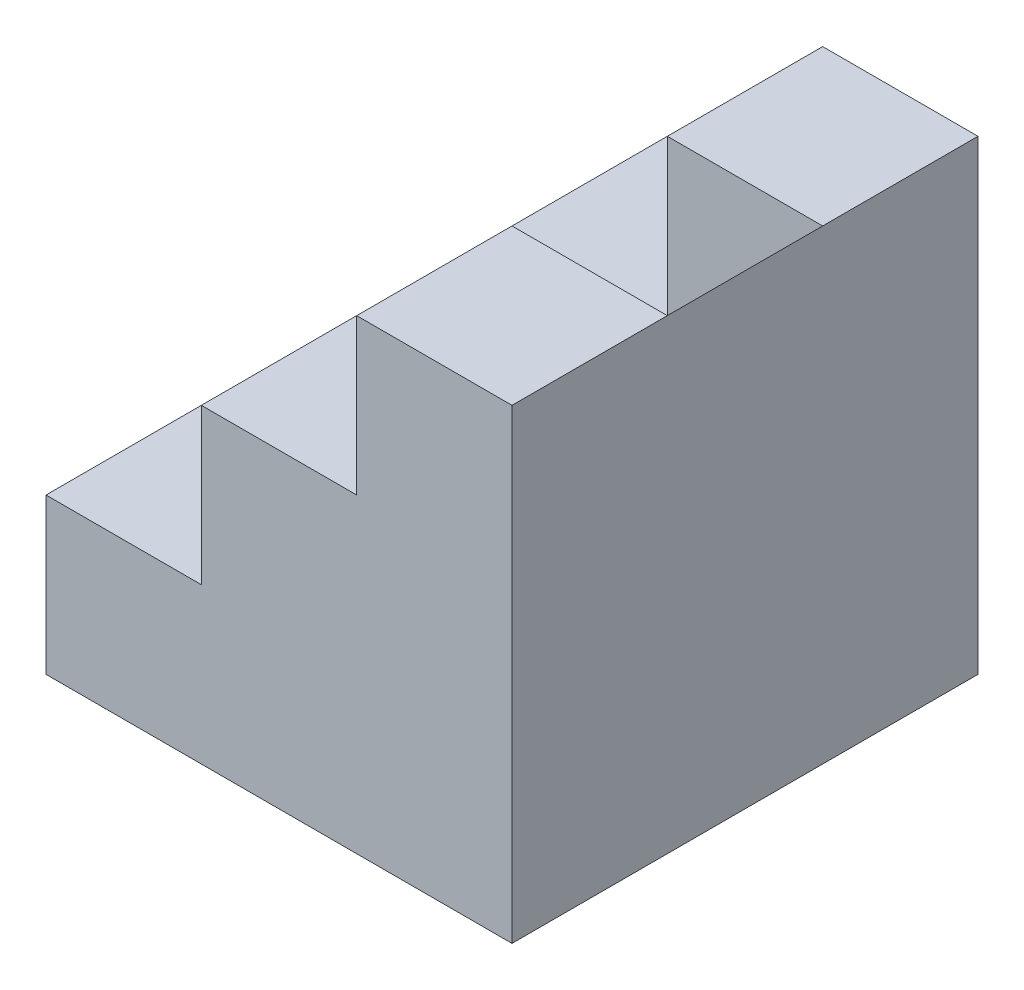
ISO-10303-21;
HEADER;
FILE_DESCRIPTION(('STEP AP214'),'2;1');
FILE_NAME('part.step','',(''),(''),'','','');
FILE_SCHEMA(('AUTOMOTIVE_DESIGN { 1 0 10303 214 1 1 1 1 }'));
ENDSEC;
DATA;
#1=APPLICATION_CONTEXT('core data for automotive mechanical design processes');
#2=APPLICATION_PROTOCOL_DEFINITION('international standard','automotive_design',2000,#1);
#3=PRODUCT_CONTEXT('',#1,'mechanical');
#4=PRODUCT('Part','Part','',(#3));
#5=PRODUCT_RELATED_PRODUCT_CATEGORY('part','',(#4));
#6=PRODUCT_DEFINITION_FORMATION('','',#4);
#7=PRODUCT_DEFINITION_CONTEXT('part definition',#1,'design');
#8=PRODUCT_DEFINITION('design','',#6,#7);
#9=PRODUCT_DEFINITION_SHAPE('','',#8);
#10=(LENGTH_UNIT() NAMED_UNIT(*) SI_UNIT(.MILLI.,.METRE.));
#11=(NAMED_UNIT(*) PLANE_ANGLE_UNIT() SI_UNIT($,.RADIAN.));
#12=(NAMED_UNIT(*) SI_UNIT($,.STERADIAN.) SOLID_ANGLE_UNIT());
#13=UNCERTAINTY_MEASURE_WITH_UNIT(LENGTH_MEASURE(1.E-05),#10,'distance_accuracy_value','');
#14=(GEOMETRIC_REPRESENTATION_CONTEXT(3) GLOBAL_UNCERTAINTY_ASSIGNED_CONTEXT((#13)) GLOBAL_UNIT_ASSIGNED_CONTEXT((#10,
#11,#12)) REPRESENTATION_CONTEXT('',''));
#15=CARTESIAN_POINT('',(0.,0.,0.));
#16=DIRECTION('',(0.,0.,1.));
#17=DIRECTION('',(1.,0.,0.));
#18=AXIS2_PLACEMENT_3D('',#15,#16,#17);
#19=CARTESIAN_POINT('',(-60.,0.,-20.));
#20=DIRECTION('',(0.,0.,1.));
#21=DIRECTION('',(1.,0.,0.));
#22=AXIS2_PLACEMENT_3D('',#19,#20,#21);
#23=PLANE('',#22);
#24=DIRECTION('',(1.,0.,0.));
#25=VECTOR('',#24,1.);
#26=CARTESIAN_POINT('',(-60.,60.,-20.));
#27=LINE('',#26,#25);
#28=CARTESIAN_POINT('',(-20.,60.,-20.));
#29=VERTEX_POINT('',#28);
#30=CARTESIAN_POINT('',(0.,60.,-20.));
#31=VERTEX_POINT('',#30);
#32=EDGE_CURVE('E197',#29,#31,#27,.T.);
#33=ORIENTED_EDGE('',*,*,#32,.T.);
#34=DIRECTION('',(-0.707106781186541,-0.707106781186554,0.));
#35=VECTOR('',#34,1.);
#36=CARTESIAN_POINT('',(0.,60.,-20.));
#37=LINE('',#36,#35);
#38=CARTESIAN_POINT('',(-20.,39.9999999999996,-20.));
#39=VERTEX_POINT('',#38);
#40=EDGE_CURVE('E48',#31,#39,#37,.T.);
#41=ORIENTED_EDGE('',*,*,#40,.T.);
#42=DIRECTION('',(0.,1.,0.));
#43=VECTOR('',#42,1.);
#44=CARTESIAN_POINT('',(-20.,0.,-20.));
#45=LINE('',#44,#43);
#46=EDGE_CURVE('E55',#39,#29,#45,.T.);
#47=ORIENTED_EDGE('',*,*,#46,.T.);
#48=EDGE_LOOP('',(#33,#41,#47));
#49=FACE_BOUND('',#48,.T.);
#50=ADVANCED_FACE('F36',(#49),#23,.F.);
#51=DIRECTION('',(1.,0.,0.));
#52=VECTOR('',#51,1.);
#53=CARTESIAN_POINT('',(0.,40.,-20.));
#54=LINE('',#53,#52);
#55=CARTESIAN_POINT('',(-40.,40.,-20.));
#56=VERTEX_POINT('',#55);
#57=EDGE_CURVE('E218',#56,#39,#54,.T.);
#58=ORIENTED_EDGE('',*,*,#57,.T.);
#59=CARTESIAN_POINT('',(-40.,19.9999999999993,-20.));
#60=VERTEX_POINT('',#59);
#61=EDGE_CURVE('E11',#39,#60,#37,.T.);
#62=ORIENTED_EDGE('',*,*,#61,.T.);
#63=DIRECTION('',(0.,1.,0.));
#64=VECTOR('',#63,1.);
#65=CARTESIAN_POINT('',(-40.,0.,-20.));
#66=LINE('',#65,#64);
#67=EDGE_CURVE('E221',#60,#56,#66,.T.);
#68=ORIENTED_EDGE('',*,*,#67,.T.);
#69=EDGE_LOOP('',(#58,#62,#68));
#70=FACE_BOUND('',#69,.T.);
#71=ADVANCED_FACE('F274',(#70),#23,.F.);
#72=CARTESIAN_POINT('',(0.,60.,-60.));
#73=DIRECTION('',(1.,0.,0.));
#74=DIRECTION('',(0.,1.,0.));
#75=AXIS2_PLACEMENT_3D('',#72,#73,#74);
#76=PLANE('',#75);
#77=DIRECTION('',(0.,0.,1.));
#78=VECTOR('',#77,1.);
#79=CARTESIAN_POINT('',(0.,0.,-60.));
#80=LINE('',#79,#78);
#81=CARTESIAN_POINT('',(0.,0.,-60.));
#82=VERTEX_POINT('',#81);
#83=CARTESIAN_POINT('',(0.,0.,0.));
#84=VERTEX_POINT('',#83);
#85=EDGE_CURVE('E229',#82,#84,#80,.T.);
#86=ORIENTED_EDGE('',*,*,#85,.F.);
#87=DIRECTION('',(0.,1.,0.));
#88=VECTOR('',#87,1.);
#89=CARTESIAN_POINT('',(0.,60.,-60.));
#90=LINE('',#89,#88);
#91=CARTESIAN_POINT('',(0.,60.,-60.));
#92=VERTEX_POINT('',#91);
#93=EDGE_CURVE('E171',#82,#92,#90,.T.);
#94=ORIENTED_EDGE('',*,*,#93,.T.);
#95=DIRECTION('',(0.,0.,1.));
#96=VECTOR('',#95,1.);
#97=CARTESIAN_POINT('',(0.,60.,-60.));
#98=LINE('',#97,#96);
#99=CARTESIAN_POINT('',(0.,60.,-40.));
#100=VERTEX_POINT('',#99);
#101=EDGE_CURVE('E161',#92,#100,#98,.T.);
#102=ORIENTED_EDGE('',*,*,#101,.T.);
#103=DIRECTION('',(0.,0.,-1.));
#104=VECTOR('',#103,1.);
#105=CARTESIAN_POINT('',(0.,60.,0.002000000000002));
#106=LINE('',#105,#104);
#107=EDGE_CURVE('E169',#31,#100,#106,.T.);
#108=ORIENTED_EDGE('',*,*,#107,.F.);
#109=DIRECTION('',(0.,0.,1.));
#110=VECTOR('',#109,1.);
#111=CARTESIAN_POINT('',(0.,60.,-60.));
#112=LINE('',#111,#110);
#113=CARTESIAN_POINT('',(0.,60.,0.));
#114=VERTEX_POINT('',#113);
#115=EDGE_CURVE('E40',#31,#114,#112,.T.);
#116=ORIENTED_EDGE('',*,*,#115,.T.);
#117=DIRECTION('',(0.,1.,0.));
#118=VECTOR('',#117,1.);
#119=CARTESIAN_POINT('',(0.,60.,0.));
#120=LINE('',#119,#118);
#121=EDGE_CURVE('E184',#84,#114,#120,.T.);
#122=ORIENTED_EDGE('',*,*,#121,.F.);
#123=EDGE_LOOP('',(#86,#94,#102,#108,#116,#122));
#124=FACE_BOUND('',#123,.T.);
#125=ADVANCED_FACE('F38',(#124),#76,.T.);
#126=CARTESIAN_POINT('',(0.,0.,-60.));
#127=DIRECTION('',(0.,-1.,0.));
#128=DIRECTION('',(1.,0.,0.));
#129=AXIS2_PLACEMENT_3D('',#126,#127,#128);
#130=PLANE('',#129);
#131=DIRECTION('',(0.,0.,1.));
#132=VECTOR('',#131,1.);
#133=CARTESIAN_POINT('',(-60.,0.,-60.));
#134=LINE('',#133,#132);
#135=CARTESIAN_POINT('',(-60.,0.,-20.));
#136=VERTEX_POINT('',#135);
#137=CARTESIAN_POINT('',(-60.,0.,0.));
#138=VERTEX_POINT('',#137);
#139=EDGE_CURVE('E209',#136,#138,#134,.T.);
#140=ORIENTED_EDGE('',*,*,#139,.F.);
#141=DIRECTION('',(0.,0.,-1.));
#142=VECTOR('',#141,1.);
#143=CARTESIAN_POINT('',(-59.9999999999989,0.,0.002000000000002));
#144=LINE('',#143,#142);
#145=CARTESIAN_POINT('',(-59.9999999999989,0.,-40.));
#146=VERTEX_POINT('',#145);
#147=EDGE_CURVE('E176',#136,#146,#144,.T.);
#148=ORIENTED_EDGE('',*,*,#147,.T.);
#149=DIRECTION('',(0.,0.,1.));
#150=VECTOR('',#149,1.);
#151=CARTESIAN_POINT('',(-60.,0.,-60.));
#152=LINE('',#151,#150);
#153=CARTESIAN_POINT('',(-60.,0.,-60.));
#154=VERTEX_POINT('',#153);
#155=EDGE_CURVE('E172',#154,#146,#152,.T.);
#156=ORIENTED_EDGE('',*,*,#155,.F.);
#157=DIRECTION('',(1.,0.,0.));
#158=VECTOR('',#157,1.);
#159=CARTESIAN_POINT('',(0.,0.,-60.));
#160=LINE('',#159,#158);
#161=EDGE_CURVE('E173',#154,#82,#160,.T.);
#162=ORIENTED_EDGE('',*,*,#161,.T.);
#163=ORIENTED_EDGE('',*,*,#85,.T.);
#164=DIRECTION('',(1.,0.,0.));
#165=VECTOR('',#164,1.);
#166=CARTESIAN_POINT('',(0.,0.,0.));
#167=LINE('',#166,#165);
#168=EDGE_CURVE('E181',#138,#84,#167,.T.);
#169=ORIENTED_EDGE('',*,*,#168,.F.);
#170=EDGE_LOOP('',(#140,#148,#156,#162,#163,#169));
#171=FACE_BOUND('',#170,.T.);
#172=ADVANCED_FACE('F242',(#171),#130,.T.);
#173=CARTESIAN_POINT('',(-60.,0.,-60.));
#174=DIRECTION('',(-1.,0.,0.));
#175=DIRECTION('',(0.,0.,1.));
#176=AXIS2_PLACEMENT_3D('',#173,#174,#175);
#177=PLANE('',#176);
#178=DIRECTION('',(0.,1.,0.));
#179=VECTOR('',#178,1.);
#180=CARTESIAN_POINT('',(-60.,0.,-20.));
#181=LINE('',#180,#179);
#182=CARTESIAN_POINT('',(-60.,20.,-20.));
#183=VERTEX_POINT('',#182);
#184=EDGE_CURVE('E226',#136,#183,#181,.T.);
#185=ORIENTED_EDGE('',*,*,#184,.F.);
#186=ORIENTED_EDGE('',*,*,#139,.T.);
#187=DIRECTION('',(0.,-1.,0.));
#188=VECTOR('',#187,1.);
#189=CARTESIAN_POINT('',(-60.,0.,0.));
#190=LINE('',#189,#188);
#191=CARTESIAN_POINT('',(-60.,20.,0.));
#192=VERTEX_POINT('',#191);
#193=EDGE_CURVE('E185',#192,#138,#190,.T.);
#194=ORIENTED_EDGE('',*,*,#193,.F.);
#195=DIRECTION('',(0.,0.,1.));
#196=VECTOR('',#195,1.);
#197=CARTESIAN_POINT('',(-60.,20.,-20.));
#198=LINE('',#197,#196);
#199=EDGE_CURVE('E195',#183,#192,#198,.T.);
#200=ORIENTED_EDGE('',*,*,#199,.F.);
#201=EDGE_LOOP('',(#185,#186,#194,#200));
#202=FACE_BOUND('',#201,.T.);
#203=ADVANCED_FACE('F234',(#202),#177,.T.);
#204=CARTESIAN_POINT('',(-60.,60.,-60.));
#205=DIRECTION('',(0.,1.,0.));
#206=DIRECTION('',(0.,0.,1.));
#207=AXIS2_PLACEMENT_3D('',#204,#205,#206);
#208=PLANE('',#207);
#209=ORIENTED_EDGE('',*,*,#32,.F.);
#210=DIRECTION('',(0.,0.,1.));
#211=VECTOR('',#210,1.);
#212=CARTESIAN_POINT('',(-20.,60.,-20.));
#213=LINE('',#212,#211);
#214=CARTESIAN_POINT('',(-20.,60.,0.));
#215=VERTEX_POINT('',#214);
#216=EDGE_CURVE('E191',#29,#215,#213,.T.);
#217=ORIENTED_EDGE('',*,*,#216,.T.);
#218=DIRECTION('',(-1.,0.,0.));
#219=VECTOR('',#218,1.);
#220=CARTESIAN_POINT('',(-60.,60.,0.));
#221=LINE('',#220,#219);
#222=EDGE_CURVE('E188',#114,#215,#221,.T.);
#223=ORIENTED_EDGE('',*,*,#222,.F.);
#224=ORIENTED_EDGE('',*,*,#115,.F.);
#225=EDGE_LOOP('',(#209,#217,#223,#224));
#226=FACE_BOUND('',#225,.T.);
#227=ADVANCED_FACE('F252',(#226),#208,.T.);
#228=CARTESIAN_POINT('',(0.,0.,0.));
#229=DIRECTION('',(0.,0.,-1.));
#230=DIRECTION('',(-1.,0.,0.));
#231=AXIS2_PLACEMENT_3D('',#228,#229,#230);
#232=PLANE('',#231);
#233=ORIENTED_EDGE('',*,*,#222,.T.);
#234=DIRECTION('',(0.,1.,0.));
#235=VECTOR('',#234,1.);
#236=CARTESIAN_POINT('',(-20.,0.,0.));
#237=LINE('',#236,#235);
#238=CARTESIAN_POINT('',(-20.,40.,0.));
#239=VERTEX_POINT('',#238);
#240=EDGE_CURVE('E194',#239,#215,#237,.T.);
#241=ORIENTED_EDGE('',*,*,#240,.F.);
#242=DIRECTION('',(1.,0.,0.));
#243=VECTOR('',#242,1.);
#244=CARTESIAN_POINT('',(0.,40.,0.));
#245=LINE('',#244,#243);
#246=CARTESIAN_POINT('',(-40.,40.,0.));
#247=VERTEX_POINT('',#246);
#248=EDGE_CURVE('E204',#247,#239,#245,.T.);
#249=ORIENTED_EDGE('',*,*,#248,.F.);
#250=DIRECTION('',(0.,1.,0.));
#251=VECTOR('',#250,1.);
#252=CARTESIAN_POINT('',(-40.,0.,0.));
#253=LINE('',#252,#251);
#254=CARTESIAN_POINT('',(-40.,20.,0.));
#255=VERTEX_POINT('',#254);
#256=EDGE_CURVE('E201',#255,#247,#253,.T.);
#257=ORIENTED_EDGE('',*,*,#256,.F.);
#258=DIRECTION('',(1.,0.,0.));
#259=VECTOR('',#258,1.);
#260=CARTESIAN_POINT('',(0.,20.,0.));
#261=LINE('',#260,#259);
#262=EDGE_CURVE('E198',#192,#255,#261,.T.);
#263=ORIENTED_EDGE('',*,*,#262,.F.);
#264=ORIENTED_EDGE('',*,*,#193,.T.);
#265=ORIENTED_EDGE('',*,*,#168,.T.);
#266=ORIENTED_EDGE('',*,*,#121,.T.);
#267=EDGE_LOOP('',(#233,#241,#249,#257,#263,#264,#265,#266));
#268=FACE_BOUND('',#267,.T.);
#269=ADVANCED_FACE('F240',(#268),#232,.F.);
#270=CARTESIAN_POINT('',(-20.,0.,-20.));
#271=DIRECTION('',(1.,0.,0.));
#272=DIRECTION('',(0.,0.,-1.));
#273=AXIS2_PLACEMENT_3D('',#270,#271,#272);
#274=PLANE('',#273);
#275=ORIENTED_EDGE('',*,*,#240,.T.);
#276=ORIENTED_EDGE('',*,*,#216,.F.);
#277=ORIENTED_EDGE('',*,*,#46,.F.);
#278=DIRECTION('',(0.,0.,1.));
#279=VECTOR('',#278,1.);
#280=CARTESIAN_POINT('',(-20.,40.,-20.));
#281=LINE('',#280,#279);
#282=EDGE_CURVE('E205',#39,#239,#281,.T.);
#283=ORIENTED_EDGE('',*,*,#282,.T.);
#284=EDGE_LOOP('',(#275,#276,#277,#283));
#285=FACE_BOUND('',#284,.T.);
#286=ADVANCED_FACE('F255',(#285),#274,.F.);
#287=CARTESIAN_POINT('',(0.,40.,-20.));
#288=DIRECTION('',(0.,-1.,0.));
#289=DIRECTION('',(0.,0.,-1.));
#290=AXIS2_PLACEMENT_3D('',#287,#288,#289);
#291=PLANE('',#290);
#292=ORIENTED_EDGE('',*,*,#248,.T.);
#293=ORIENTED_EDGE('',*,*,#282,.F.);
#294=ORIENTED_EDGE('',*,*,#57,.F.);
#295=DIRECTION('',(0.,0.,1.));
#296=VECTOR('',#295,1.);
#297=CARTESIAN_POINT('',(-40.,40.,-20.));
#298=LINE('',#297,#296);
#299=EDGE_CURVE('E202',#56,#247,#298,.T.);
#300=ORIENTED_EDGE('',*,*,#299,.T.);
#301=EDGE_LOOP('',(#292,#293,#294,#300));
#302=FACE_BOUND('',#301,.T.);
#303=ADVANCED_FACE('F259',(#302),#291,.F.);
#304=CARTESIAN_POINT('',(-40.,0.,-20.));
#305=DIRECTION('',(1.,0.,0.));
#306=DIRECTION('',(0.,0.,-1.));
#307=AXIS2_PLACEMENT_3D('',#304,#305,#306);
#308=PLANE('',#307);
#309=ORIENTED_EDGE('',*,*,#256,.T.);
#310=ORIENTED_EDGE('',*,*,#299,.F.);
#311=ORIENTED_EDGE('',*,*,#67,.F.);
#312=DIRECTION('',(0.,0.,1.));
#313=VECTOR('',#312,1.);
#314=CARTESIAN_POINT('',(-40.,20.,-20.));
#315=LINE('',#314,#313);
#316=EDGE_CURVE('E199',#60,#255,#315,.T.);
#317=ORIENTED_EDGE('',*,*,#316,.T.);
#318=EDGE_LOOP('',(#309,#310,#311,#317));
#319=FACE_BOUND('',#318,.T.);
#320=ADVANCED_FACE('F262',(#319),#308,.F.);
#321=CARTESIAN_POINT('',(0.,20.,-20.));
#322=DIRECTION('',(0.,-1.,0.));
#323=DIRECTION('',(0.,0.,-1.));
#324=AXIS2_PLACEMENT_3D('',#321,#322,#323);
#325=PLANE('',#324);
#326=ORIENTED_EDGE('',*,*,#262,.T.);
#327=ORIENTED_EDGE('',*,*,#316,.F.);
#328=DIRECTION('',(1.,0.,0.));
#329=VECTOR('',#328,1.);
#330=CARTESIAN_POINT('',(0.,20.,-20.));
#331=LINE('',#330,#329);
#332=EDGE_CURVE('E223',#183,#60,#331,.T.);
#333=ORIENTED_EDGE('',*,*,#332,.F.);
#334=ORIENTED_EDGE('',*,*,#199,.T.);
#335=EDGE_LOOP('',(#326,#327,#333,#334));
#336=FACE_BOUND('',#335,.T.);
#337=ADVANCED_FACE('F267',(#336),#325,.F.);
#338=ORIENTED_EDGE('',*,*,#332,.T.);
#339=EDGE_CURVE('E46',#60,#136,#37,.T.);
#340=ORIENTED_EDGE('',*,*,#339,.T.);
#341=ORIENTED_EDGE('',*,*,#184,.T.);
#342=EDGE_LOOP('',(#338,#340,#341));
#343=FACE_BOUND('',#342,.T.);
#344=ADVANCED_FACE('F270',(#343),#23,.F.);
#345=CARTESIAN_POINT('',(0.,60.,0.002000000000002));
#346=DIRECTION('',(0.707106781186554,-0.707106781186541,0.));
#347=DIRECTION('',(0.707106781186541,0.707106781186554,0.));
#348=AXIS2_PLACEMENT_3D('',#345,#346,#347);
#349=PLANE('',#348);
#350=ORIENTED_EDGE('',*,*,#40,.F.);
#351=ORIENTED_EDGE('',*,*,#107,.T.);
#352=DIRECTION('',(-0.707106781186541,-0.707106781186554,0.));
#353=VECTOR('',#352,1.);
#354=CARTESIAN_POINT('',(0.,60.,-40.));
#355=LINE('',#354,#353);
#356=CARTESIAN_POINT('',(-20.,40.,-40.));
#357=VERTEX_POINT('',#356);
#358=EDGE_CURVE('E143',#100,#357,#355,.T.);
#359=ORIENTED_EDGE('',*,*,#358,.T.);
#360=CARTESIAN_POINT('',(-40.,20.,-40.));
#361=VERTEX_POINT('',#360);
#362=EDGE_CURVE('E153',#357,#361,#355,.T.);
#363=ORIENTED_EDGE('',*,*,#362,.T.);
#364=EDGE_CURVE('E155',#361,#146,#355,.T.);
#365=ORIENTED_EDGE('',*,*,#364,.T.);
#366=ORIENTED_EDGE('',*,*,#147,.F.);
#367=ORIENTED_EDGE('',*,*,#339,.F.);
#368=ORIENTED_EDGE('',*,*,#61,.F.);
#369=EDGE_LOOP('',(#350,#351,#359,#363,#365,#366,#367,#368));
#370=FACE_BOUND('',#369,.T.);
#371=ADVANCED_FACE('F175',(#370),#349,.F.);
#372=CARTESIAN_POINT('',(-60.,0.,-40.));
#373=DIRECTION('',(0.,0.,-1.));
#374=DIRECTION('',(-1.,0.,0.));
#375=AXIS2_PLACEMENT_3D('',#372,#373,#374);
#376=PLANE('',#375);
#377=ORIENTED_EDGE('',*,*,#358,.F.);
#378=DIRECTION('',(-1.,0.,0.));
#379=VECTOR('',#378,1.);
#380=CARTESIAN_POINT('',(-60.,60.,-40.));
#381=LINE('',#380,#379);
#382=CARTESIAN_POINT('',(-20.,60.,-40.));
#383=VERTEX_POINT('',#382);
#384=EDGE_CURVE('E146',#100,#383,#381,.T.);
#385=ORIENTED_EDGE('',*,*,#384,.T.);
#386=DIRECTION('',(0.,-1.,0.));
#387=VECTOR('',#386,1.);
#388=CARTESIAN_POINT('',(-20.,0.,-40.));
#389=LINE('',#388,#387);
#390=EDGE_CURVE('E148',#383,#357,#389,.T.);
#391=ORIENTED_EDGE('',*,*,#390,.T.);
#392=EDGE_LOOP('',(#377,#385,#391));
#393=FACE_BOUND('',#392,.T.);
#394=ADVANCED_FACE('F145',(#393),#376,.F.);
#395=ORIENTED_EDGE('',*,*,#362,.F.);
#396=DIRECTION('',(-1.,0.,0.));
#397=VECTOR('',#396,1.);
#398=CARTESIAN_POINT('',(0.,40.,-40.));
#399=LINE('',#398,#397);
#400=CARTESIAN_POINT('',(-40.,40.,-40.));
#401=VERTEX_POINT('',#400);
#402=EDGE_CURVE('E485',#357,#401,#399,.T.);
#403=ORIENTED_EDGE('',*,*,#402,.T.);
#404=DIRECTION('',(0.,-1.,0.));
#405=VECTOR('',#404,1.);
#406=CARTESIAN_POINT('',(-40.,0.,-40.));
#407=LINE('',#406,#405);
#408=EDGE_CURVE('E482',#401,#361,#407,.T.);
#409=ORIENTED_EDGE('',*,*,#408,.T.);
#410=EDGE_LOOP('',(#395,#403,#409));
#411=FACE_BOUND('',#410,.T.);
#412=ADVANCED_FACE('F364',(#411),#376,.F.);
#413=CARTESIAN_POINT('',(0.,0.,-60.));
#414=DIRECTION('',(0.,0.,-1.));
#415=DIRECTION('',(-1.,0.,0.));
#416=AXIS2_PLACEMENT_3D('',#413,#414,#415);
#417=PLANE('',#416);
#418=DIRECTION('',(0.,-1.,0.));
#419=VECTOR('',#418,1.);
#420=CARTESIAN_POINT('',(-20.,0.,-60.));
#421=LINE('',#420,#419);
#422=CARTESIAN_POINT('',(-20.,60.,-60.));
#423=VERTEX_POINT('',#422);
#424=CARTESIAN_POINT('',(-20.,40.,-60.));
#425=VERTEX_POINT('',#424);
#426=EDGE_CURVE('E506',#423,#425,#421,.T.);
#427=ORIENTED_EDGE('',*,*,#426,.F.);
#428=DIRECTION('',(-1.,0.,0.));
#429=VECTOR('',#428,1.);
#430=CARTESIAN_POINT('',(-60.,60.,-60.));
#431=LINE('',#430,#429);
#432=EDGE_CURVE('E518',#92,#423,#431,.T.);
#433=ORIENTED_EDGE('',*,*,#432,.F.);
#434=ORIENTED_EDGE('',*,*,#93,.F.);
#435=ORIENTED_EDGE('',*,*,#161,.F.);
#436=DIRECTION('',(0.,-1.,0.));
#437=VECTOR('',#436,1.);
#438=CARTESIAN_POINT('',(-60.,0.,-60.));
#439=LINE('',#438,#437);
#440=CARTESIAN_POINT('',(-60.,20.,-60.));
#441=VERTEX_POINT('',#440);
#442=EDGE_CURVE('E520',#441,#154,#439,.T.);
#443=ORIENTED_EDGE('',*,*,#442,.F.);
#444=DIRECTION('',(-1.,0.,0.));
#445=VECTOR('',#444,1.);
#446=CARTESIAN_POINT('',(0.,20.,-60.));
#447=LINE('',#446,#445);
#448=CARTESIAN_POINT('',(-40.,20.,-60.));
#449=VERTEX_POINT('',#448);
#450=EDGE_CURVE('E504',#449,#441,#447,.T.);
#451=ORIENTED_EDGE('',*,*,#450,.F.);
#452=DIRECTION('',(0.,-1.,0.));
#453=VECTOR('',#452,1.);
#454=CARTESIAN_POINT('',(-40.,0.,-60.));
#455=LINE('',#454,#453);
#456=CARTESIAN_POINT('',(-40.,40.,-60.));
#457=VERTEX_POINT('',#456);
#458=EDGE_CURVE('E492',#457,#449,#455,.T.);
#459=ORIENTED_EDGE('',*,*,#458,.F.);
#460=DIRECTION('',(-1.,0.,0.));
#461=VECTOR('',#460,1.);
#462=CARTESIAN_POINT('',(0.,40.,-60.));
#463=LINE('',#462,#461);
#464=EDGE_CURVE('E487',#425,#457,#463,.T.);
#465=ORIENTED_EDGE('',*,*,#464,.F.);
#466=EDGE_LOOP('',(#427,#433,#434,#435,#443,#451,#459,#465));
#467=FACE_BOUND('',#466,.T.);
#468=ADVANCED_FACE('F375',(#467),#417,.T.);
#469=CARTESIAN_POINT('',(-20.,0.,-40.));
#470=DIRECTION('',(1.,0.,0.));
#471=DIRECTION('',(0.,1.,0.));
#472=AXIS2_PLACEMENT_3D('',#469,#470,#471);
#473=PLANE('',#472);
#474=ORIENTED_EDGE('',*,*,#426,.T.);
#475=DIRECTION('',(0.,0.,-1.));
#476=VECTOR('',#475,1.);
#477=CARTESIAN_POINT('',(-20.,40.,-40.));
#478=LINE('',#477,#476);
#479=EDGE_CURVE('E513',#357,#425,#478,.T.);
#480=ORIENTED_EDGE('',*,*,#479,.F.);
#481=ORIENTED_EDGE('',*,*,#390,.F.);
#482=DIRECTION('',(0.,0.,-1.));
#483=VECTOR('',#482,1.);
#484=CARTESIAN_POINT('',(-20.,60.,-40.));
#485=LINE('',#484,#483);
#486=EDGE_CURVE('E163',#383,#423,#485,.T.);
#487=ORIENTED_EDGE('',*,*,#486,.T.);
#488=EDGE_LOOP('',(#474,#480,#481,#487));
#489=FACE_BOUND('',#488,.T.);
#490=ADVANCED_FACE('F384',(#489),#473,.F.);
#491=CARTESIAN_POINT('',(0.,40.,-40.));
#492=DIRECTION('',(0.,-1.,0.));
#493=DIRECTION('',(0.,0.,-1.));
#494=AXIS2_PLACEMENT_3D('',#491,#492,#493);
#495=PLANE('',#494);
#496=ORIENTED_EDGE('',*,*,#464,.T.);
#497=DIRECTION('',(0.,0.,-1.));
#498=VECTOR('',#497,1.);
#499=CARTESIAN_POINT('',(-40.,40.,-40.));
#500=LINE('',#499,#498);
#501=EDGE_CURVE('E511',#401,#457,#500,.T.);
#502=ORIENTED_EDGE('',*,*,#501,.F.);
#503=ORIENTED_EDGE('',*,*,#402,.F.);
#504=ORIENTED_EDGE('',*,*,#479,.T.);
#505=EDGE_LOOP('',(#496,#502,#503,#504));
#506=FACE_BOUND('',#505,.T.);
#507=ADVANCED_FACE('F394',(#506),#495,.F.);
#508=CARTESIAN_POINT('',(0.,20.,-40.));
#509=DIRECTION('',(0.,-1.,0.));
#510=DIRECTION('',(1.,0.,0.));
#511=AXIS2_PLACEMENT_3D('',#508,#509,#510);
#512=PLANE('',#511);
#513=ORIENTED_EDGE('',*,*,#450,.T.);
#514=DIRECTION('',(0.,0.,-1.));
#515=VECTOR('',#514,1.);
#516=CARTESIAN_POINT('',(-60.,20.,-40.));
#517=LINE('',#516,#515);
#518=CARTESIAN_POINT('',(-60.,20.,-40.));
#519=VERTEX_POINT('',#518);
#520=EDGE_CURVE('E494',#519,#441,#517,.T.);
#521=ORIENTED_EDGE('',*,*,#520,.F.);
#522=DIRECTION('',(-1.,0.,0.));
#523=VECTOR('',#522,1.);
#524=CARTESIAN_POINT('',(0.,20.,-40.));
#525=LINE('',#524,#523);
#526=EDGE_CURVE('E479',#361,#519,#525,.T.);
#527=ORIENTED_EDGE('',*,*,#526,.F.);
#528=DIRECTION('',(0.,0.,-1.));
#529=VECTOR('',#528,1.);
#530=CARTESIAN_POINT('',(-40.,20.,-40.));
#531=LINE('',#530,#529);
#532=EDGE_CURVE('E490',#361,#449,#531,.T.);
#533=ORIENTED_EDGE('',*,*,#532,.T.);
#534=EDGE_LOOP('',(#513,#521,#527,#533));
#535=FACE_BOUND('',#534,.T.);
#536=ADVANCED_FACE('F404',(#535),#512,.F.);
#537=CARTESIAN_POINT('',(-40.,0.,-40.));
#538=DIRECTION('',(1.,0.,0.));
#539=DIRECTION('',(0.,0.,-1.));
#540=AXIS2_PLACEMENT_3D('',#537,#538,#539);
#541=PLANE('',#540);
#542=ORIENTED_EDGE('',*,*,#458,.T.);
#543=ORIENTED_EDGE('',*,*,#532,.F.);
#544=ORIENTED_EDGE('',*,*,#408,.F.);
#545=ORIENTED_EDGE('',*,*,#501,.T.);
#546=EDGE_LOOP('',(#542,#543,#544,#545));
#547=FACE_BOUND('',#546,.T.);
#548=ADVANCED_FACE('F414',(#547),#541,.F.);
#549=CARTESIAN_POINT('',(-60.,60.,-60.));
#550=DIRECTION('',(0.,1.,0.));
#551=DIRECTION('',(0.,0.,1.));
#552=AXIS2_PLACEMENT_3D('',#549,#550,#551);
#553=PLANE('',#552);
#554=ORIENTED_EDGE('',*,*,#384,.F.);
#555=ORIENTED_EDGE('',*,*,#101,.F.);
#556=ORIENTED_EDGE('',*,*,#432,.T.);
#557=ORIENTED_EDGE('',*,*,#486,.F.);
#558=EDGE_LOOP('',(#554,#555,#556,#557));
#559=FACE_BOUND('',#558,.T.);
#560=ADVANCED_FACE('F159',(#559),#553,.T.);
#561=CARTESIAN_POINT('',(-60.,0.,-60.));
#562=DIRECTION('',(-1.,0.,0.));
#563=DIRECTION('',(0.,0.,1.));
#564=AXIS2_PLACEMENT_3D('',#561,#562,#563);
#565=PLANE('',#564);
#566=DIRECTION('',(0.,1.,0.));
#567=VECTOR('',#566,1.);
#568=CARTESIAN_POINT('',(-60.,0.,-40.));
#569=LINE('',#568,#567);
#570=EDGE_CURVE('E164',#146,#519,#569,.T.);
#571=ORIENTED_EDGE('',*,*,#570,.T.);
#572=ORIENTED_EDGE('',*,*,#520,.T.);
#573=ORIENTED_EDGE('',*,*,#442,.T.);
#574=ORIENTED_EDGE('',*,*,#155,.T.);
#575=EDGE_LOOP('',(#571,#572,#573,#574));
#576=FACE_BOUND('',#575,.T.);
#577=ADVANCED_FACE('F433',(#576),#565,.T.);
#578=ORIENTED_EDGE('',*,*,#364,.F.);
#579=ORIENTED_EDGE('',*,*,#526,.T.);
#580=ORIENTED_EDGE('',*,*,#570,.F.);
#581=EDGE_LOOP('',(#578,#579,#580));
#582=FACE_BOUND('',#581,.T.);
#583=ADVANCED_FACE('F366',(#582),#376,.F.);
#584=CLOSED_SHELL('',(#50,#71,#125,#172,#203,#227,#269,#286,#303,#320,#337,#344,#371,#394,#412,
#468,#490,#507,#536,#548,#560,#577,#583));
#585=MANIFOLD_SOLID_BREP('B2',#584);
#586=ADVANCED_BREP_SHAPE_REPRESENTATION('',(#18,#585),#14);
#587=SHAPE_DEFINITION_REPRESENTATION(#9,#586);
ENDSEC;
END-ISO-10303-21;
